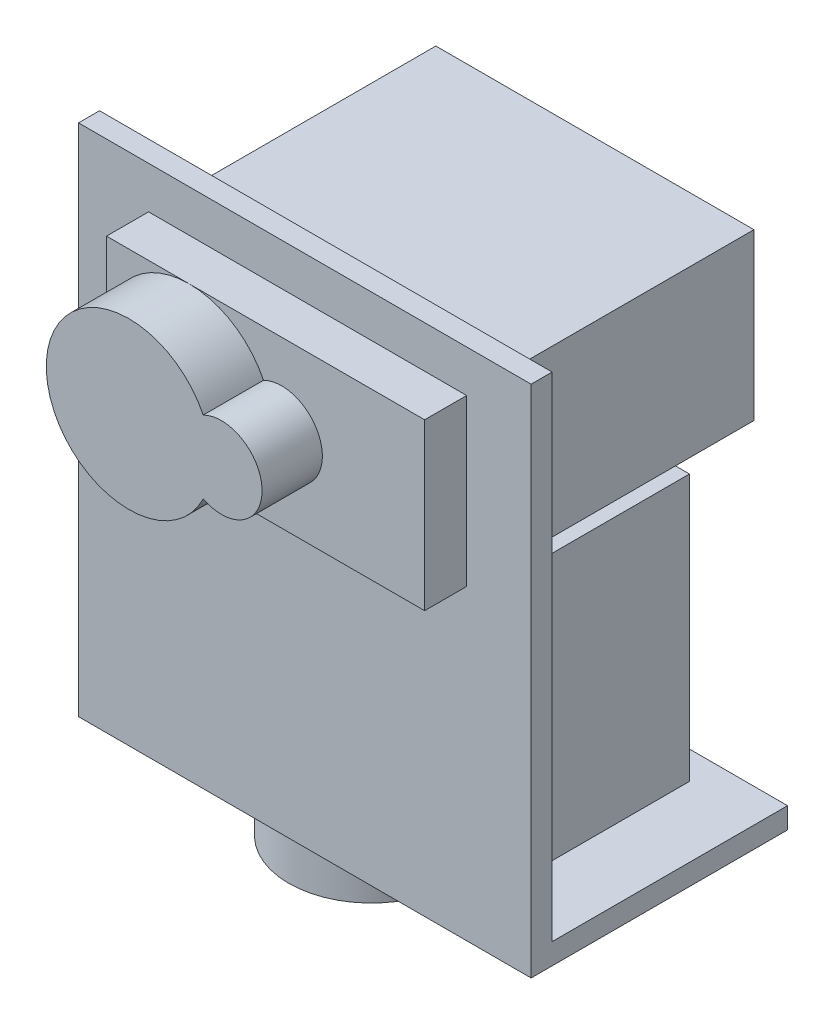
ISO-10303-21;
HEADER;
FILE_DESCRIPTION(('STEP AP214'),'2;1');
FILE_NAME('part.step','',(''),(''),'','','');
FILE_SCHEMA(('AUTOMOTIVE_DESIGN { 1 0 10303 214 1 1 1 1 }'));
ENDSEC;
DATA;
#1=APPLICATION_CONTEXT('core data for automotive mechanical design processes');
#2=APPLICATION_PROTOCOL_DEFINITION('international standard','automotive_design',2000,#1);
#3=PRODUCT_CONTEXT('',#1,'mechanical');
#4=PRODUCT('Part','Part','',(#3));
#5=PRODUCT_RELATED_PRODUCT_CATEGORY('part','',(#4));
#6=PRODUCT_DEFINITION_FORMATION('','',#4);
#7=PRODUCT_DEFINITION_CONTEXT('part definition',#1,'design');
#8=PRODUCT_DEFINITION('design','',#6,#7);
#9=PRODUCT_DEFINITION_SHAPE('','',#8);
#10=(LENGTH_UNIT() NAMED_UNIT(*) SI_UNIT(.MILLI.,.METRE.));
#11=(NAMED_UNIT(*) PLANE_ANGLE_UNIT() SI_UNIT($,.RADIAN.));
#12=(NAMED_UNIT(*) SI_UNIT($,.STERADIAN.) SOLID_ANGLE_UNIT());
#13=UNCERTAINTY_MEASURE_WITH_UNIT(LENGTH_MEASURE(1.E-05),#10,'distance_accuracy_value','');
#14=(GEOMETRIC_REPRESENTATION_CONTEXT(3) GLOBAL_UNCERTAINTY_ASSIGNED_CONTEXT((#13)) GLOBAL_UNIT_ASSIGNED_CONTEXT((#10,
#11,#12)) REPRESENTATION_CONTEXT('',''));
#15=CARTESIAN_POINT('',(0.,0.,0.));
#16=DIRECTION('',(0.,0.,1.));
#17=DIRECTION('',(1.,0.,0.));
#18=AXIS2_PLACEMENT_3D('',#15,#16,#17);
#19=CARTESIAN_POINT('',(0.,0.,4.5));
#20=DIRECTION('',(0.,0.,-1.));
#21=DIRECTION('',(-1.,0.,0.));
#22=AXIS2_PLACEMENT_3D('',#19,#20,#21);
#23=PLANE('',#22);
#24=CARTESIAN_POINT('',(-5.25,9.44999999999999,4.5));
#25=DIRECTION('',(0.,0.,1.));
#26=DIRECTION('',(0.,-1.,0.));
#27=AXIS2_PLACEMENT_3D('',#24,#25,#26);
#28=CIRCLE('',#27,5.9);
#29=CARTESIAN_POINT('',(0.0500000000000066,12.0422962793631,4.5));
#30=VERTEX_POINT('',#29);
#31=CARTESIAN_POINT('',(-5.25,15.35,4.5));
#32=VERTEX_POINT('',#31);
#33=EDGE_CURVE('E63',#30,#32,#28,.T.);
#34=ORIENTED_EDGE('',*,*,#33,.F.);
#35=CARTESIAN_POINT('',(1.35,9.44999999999999,4.5));
#36=DIRECTION('',(0.,0.,1.));
#37=DIRECTION('',(0.,-1.,0.));
#38=AXIS2_PLACEMENT_3D('',#35,#36,#37);
#39=CIRCLE('',#38,2.9);
#40=CARTESIAN_POINT('',(0.0500000000000066,6.85770372063684,4.5));
#41=VERTEX_POINT('',#40);
#42=EDGE_CURVE('E345',#41,#30,#39,.T.);
#43=ORIENTED_EDGE('',*,*,#42,.F.);
#44=CARTESIAN_POINT('',(-5.25,3.54999999999999,4.5));
#45=VERTEX_POINT('',#44);
#46=EDGE_CURVE('E351',#45,#41,#28,.T.);
#47=ORIENTED_EDGE('',*,*,#46,.F.);
#48=DIRECTION('',(1.,0.,0.));
#49=VECTOR('',#48,1.);
#50=CARTESIAN_POINT('',(11.55,3.54999999999999,4.5));
#51=LINE('',#50,#49);
#52=CARTESIAN_POINT('',(11.55,3.54999999999999,4.5));
#53=VERTEX_POINT('',#52);
#54=EDGE_CURVE('E378',#45,#53,#51,.T.);
#55=ORIENTED_EDGE('',*,*,#54,.T.);
#56=DIRECTION('',(0.,1.,0.));
#57=VECTOR('',#56,1.);
#58=CARTESIAN_POINT('',(11.55,15.35,4.5));
#59=LINE('',#58,#57);
#60=CARTESIAN_POINT('',(11.55,15.35,4.5));
#61=VERTEX_POINT('',#60);
#62=EDGE_CURVE('E363',#53,#61,#59,.T.);
#63=ORIENTED_EDGE('',*,*,#62,.T.);
#64=DIRECTION('',(-1.,0.,0.));
#65=VECTOR('',#64,1.);
#66=CARTESIAN_POINT('',(11.55,15.35,4.5));
#67=LINE('',#66,#65);
#68=EDGE_CURVE('E369',#61,#32,#67,.T.);
#69=ORIENTED_EDGE('',*,*,#68,.T.);
#70=EDGE_LOOP('',(#34,#43,#47,#55,#63,#69));
#71=FACE_BOUND('',#70,.T.);
#72=ADVANCED_FACE('F51',(#71),#23,.F.);
#73=CARTESIAN_POINT('',(-11.15,9.44999999999999,4.5));
#74=VERTEX_POINT('',#73);
#75=EDGE_CURVE('E11',#32,#74,#28,.T.);
#76=ORIENTED_EDGE('',*,*,#75,.F.);
#77=CARTESIAN_POINT('',(-11.15,15.35,4.5));
#78=VERTEX_POINT('',#77);
#79=EDGE_CURVE('E367',#32,#78,#67,.T.);
#80=ORIENTED_EDGE('',*,*,#79,.T.);
#81=DIRECTION('',(0.,-1.,0.));
#82=VECTOR('',#81,1.);
#83=CARTESIAN_POINT('',(-11.15,15.35,4.5));
#84=LINE('',#83,#82);
#85=EDGE_CURVE('E374',#78,#74,#84,.T.);
#86=ORIENTED_EDGE('',*,*,#85,.T.);
#87=EDGE_LOOP('',(#76,#80,#86));
#88=FACE_BOUND('',#87,.T.);
#89=ADVANCED_FACE('F578',(#88),#23,.F.);
#90=CARTESIAN_POINT('',(0.,0.,1.5));
#91=DIRECTION('',(0.,0.,-1.));
#92=DIRECTION('',(-1.,0.,0.));
#93=AXIS2_PLACEMENT_3D('',#90,#91,#92);
#94=PLANE('',#93);
#95=DIRECTION('',(0.,1.,0.));
#96=VECTOR('',#95,1.);
#97=CARTESIAN_POINT('',(16.15,-18.35,1.5));
#98=LINE('',#97,#96);
#99=CARTESIAN_POINT('',(16.15,-18.35,1.5));
#100=VERTEX_POINT('',#99);
#101=CARTESIAN_POINT('',(16.15,18.35,1.5));
#102=VERTEX_POINT('',#101);
#103=EDGE_CURVE('E514',#100,#102,#98,.T.);
#104=ORIENTED_EDGE('',*,*,#103,.T.);
#105=DIRECTION('',(-1.,0.,0.));
#106=VECTOR('',#105,1.);
#107=CARTESIAN_POINT('',(-16.15,18.35,1.5));
#108=LINE('',#107,#106);
#109=CARTESIAN_POINT('',(-16.15,18.35,1.5));
#110=VERTEX_POINT('',#109);
#111=EDGE_CURVE('E518',#102,#110,#108,.T.);
#112=ORIENTED_EDGE('',*,*,#111,.T.);
#113=DIRECTION('',(0.,-1.,0.));
#114=VECTOR('',#113,1.);
#115=CARTESIAN_POINT('',(-16.15,-18.35,1.5));
#116=LINE('',#115,#114);
#117=CARTESIAN_POINT('',(-16.15,-18.35,1.5));
#118=VERTEX_POINT('',#117);
#119=EDGE_CURVE('E522',#110,#118,#116,.T.);
#120=ORIENTED_EDGE('',*,*,#119,.T.);
#121=DIRECTION('',(1.,0.,0.));
#122=VECTOR('',#121,1.);
#123=CARTESIAN_POINT('',(-16.15,-18.35,1.5));
#124=LINE('',#123,#122);
#125=EDGE_CURVE('E525',#118,#100,#124,.T.);
#126=ORIENTED_EDGE('',*,*,#125,.T.);
#127=EDGE_LOOP('',(#104,#112,#120,#126));
#128=FACE_BOUND('',#127,.T.);
#129=DIRECTION('',(0.,1.,0.));
#130=VECTOR('',#129,1.);
#131=CARTESIAN_POINT('',(11.55,15.35,1.5));
#132=LINE('',#131,#130);
#133=CARTESIAN_POINT('',(11.55,3.54999999999999,1.5));
#134=VERTEX_POINT('',#133);
#135=CARTESIAN_POINT('',(11.55,15.35,1.5));
#136=VERTEX_POINT('',#135);
#137=EDGE_CURVE('E362',#134,#136,#132,.T.);
#138=ORIENTED_EDGE('',*,*,#137,.F.);
#139=DIRECTION('',(1.,0.,0.));
#140=VECTOR('',#139,1.);
#141=CARTESIAN_POINT('',(11.55,3.54999999999999,1.5));
#142=LINE('',#141,#140);
#143=CARTESIAN_POINT('',(-11.15,3.54999999999999,1.5));
#144=VERTEX_POINT('',#143);
#145=EDGE_CURVE('E368',#144,#134,#142,.T.);
#146=ORIENTED_EDGE('',*,*,#145,.F.);
#147=DIRECTION('',(0.,-1.,0.));
#148=VECTOR('',#147,1.);
#149=CARTESIAN_POINT('',(-11.15,15.35,1.5));
#150=LINE('',#149,#148);
#151=CARTESIAN_POINT('',(-11.15,15.35,1.5));
#152=VERTEX_POINT('',#151);
#153=EDGE_CURVE('E391',#152,#144,#150,.T.);
#154=ORIENTED_EDGE('',*,*,#153,.F.);
#155=DIRECTION('',(-1.,0.,0.));
#156=VECTOR('',#155,1.);
#157=CARTESIAN_POINT('',(11.55,15.35,1.5));
#158=LINE('',#157,#156);
#159=EDGE_CURVE('E387',#136,#152,#158,.T.);
#160=ORIENTED_EDGE('',*,*,#159,.F.);
#161=EDGE_LOOP('',(#138,#146,#154,#160));
#162=FACE_BOUND('',#161,.T.);
#163=ADVANCED_FACE('F642',(#128,#162),#94,.F.);
#164=CARTESIAN_POINT('',(0.,-21.35,0.));
#165=DIRECTION('',(0.,1.,0.));
#166=DIRECTION('',(0.,0.,1.));
#167=AXIS2_PLACEMENT_3D('',#164,#165,#166);
#168=PLANE('',#167);
#169=CARTESIAN_POINT('',(-5.65,-21.35,-8.9));
#170=DIRECTION('',(0.,-1.,0.));
#171=DIRECTION('',(0.,0.,-1.));
#172=AXIS2_PLACEMENT_3D('',#169,#170,#171);
#173=CIRCLE('',#172,5.9);
#174=CARTESIAN_POINT('',(-0.35,-21.35,-6.30770372063686));
#175=VERTEX_POINT('',#174);
#176=CARTESIAN_POINT('',(-5.65,-21.35,-3.));
#177=VERTEX_POINT('',#176);
#178=EDGE_CURVE('E419',#175,#177,#173,.T.);
#179=ORIENTED_EDGE('',*,*,#178,.F.);
#180=CARTESIAN_POINT('',(0.949999999999996,-21.35,-8.9));
#181=DIRECTION('',(0.,-1.,0.));
#182=DIRECTION('',(0.,0.,-1.));
#183=AXIS2_PLACEMENT_3D('',#180,#181,#182);
#184=CIRCLE('',#183,2.9);
#185=CARTESIAN_POINT('',(-0.35,-21.35,-11.4922962793631));
#186=VERTEX_POINT('',#185);
#187=EDGE_CURVE('E413',#175,#186,#184,.F.);
#188=ORIENTED_EDGE('',*,*,#187,.T.);
#189=CARTESIAN_POINT('',(-5.65,-21.35,-14.8));
#190=VERTEX_POINT('',#189);
#191=EDGE_CURVE('E429',#190,#186,#173,.T.);
#192=ORIENTED_EDGE('',*,*,#191,.F.);
#193=DIRECTION('',(1.,0.,0.));
#194=VECTOR('',#193,1.);
#195=CARTESIAN_POINT('',(-11.55,-21.35,-14.8));
#196=LINE('',#195,#194);
#197=CARTESIAN_POINT('',(11.15,-21.35,-14.8));
#198=VERTEX_POINT('',#197);
#199=EDGE_CURVE('E442',#190,#198,#196,.T.);
#200=ORIENTED_EDGE('',*,*,#199,.T.);
#201=DIRECTION('',(0.,0.,1.));
#202=VECTOR('',#201,1.);
#203=CARTESIAN_POINT('',(11.15,-21.35,-14.8));
#204=LINE('',#203,#202);
#205=CARTESIAN_POINT('',(11.15,-21.35,-3.));
#206=VERTEX_POINT('',#205);
#207=EDGE_CURVE('E448',#198,#206,#204,.T.);
#208=ORIENTED_EDGE('',*,*,#207,.T.);
#209=DIRECTION('',(-1.,0.,0.));
#210=VECTOR('',#209,1.);
#211=CARTESIAN_POINT('',(-11.55,-21.35,-3.));
#212=LINE('',#211,#210);
#213=EDGE_CURVE('E452',#206,#177,#212,.T.);
#214=ORIENTED_EDGE('',*,*,#213,.T.);
#215=EDGE_LOOP('',(#179,#188,#192,#200,#208,#214));
#216=FACE_BOUND('',#215,.T.);
#217=ADVANCED_FACE('F616',(#216),#168,.F.);
#218=CARTESIAN_POINT('',(-11.55,-21.35,-8.9));
#219=VERTEX_POINT('',#218);
#220=EDGE_CURVE('E428',#177,#219,#173,.T.);
#221=ORIENTED_EDGE('',*,*,#220,.F.);
#222=CARTESIAN_POINT('',(-11.55,-21.35,-3.));
#223=VERTEX_POINT('',#222);
#224=EDGE_CURVE('E451',#177,#223,#212,.T.);
#225=ORIENTED_EDGE('',*,*,#224,.T.);
#226=DIRECTION('',(0.,0.,-1.));
#227=VECTOR('',#226,1.);
#228=CARTESIAN_POINT('',(-11.55,-21.35,-14.8));
#229=LINE('',#228,#227);
#230=EDGE_CURVE('E438',#223,#219,#229,.T.);
#231=ORIENTED_EDGE('',*,*,#230,.T.);
#232=EDGE_LOOP('',(#221,#225,#231));
#233=FACE_BOUND('',#232,.T.);
#234=ADVANCED_FACE('F598',(#233),#168,.F.);
#235=CARTESIAN_POINT('',(-16.15,-18.35,1.5));
#236=DIRECTION('',(0.,1.,0.));
#237=DIRECTION('',(0.,0.,1.));
#238=AXIS2_PLACEMENT_3D('',#235,#236,#237);
#239=PLANE('',#238);
#240=DIRECTION('',(0.,0.,-1.));
#241=VECTOR('',#240,1.);
#242=CARTESIAN_POINT('',(-16.15,-18.35,1.5));
#243=LINE('',#242,#241);
#244=CARTESIAN_POINT('',(-16.15,-18.35,-16.8));
#245=VERTEX_POINT('',#244);
#246=EDGE_CURVE('E539',#118,#245,#243,.T.);
#247=ORIENTED_EDGE('',*,*,#246,.T.);
#248=DIRECTION('',(-1.,0.,0.));
#249=VECTOR('',#248,1.);
#250=CARTESIAN_POINT('',(16.15,-18.35,-16.8));
#251=LINE('',#250,#249);
#252=CARTESIAN_POINT('',(16.15,-18.35,-16.8));
#253=VERTEX_POINT('',#252);
#254=EDGE_CURVE('E492',#253,#245,#251,.T.);
#255=ORIENTED_EDGE('',*,*,#254,.F.);
#256=DIRECTION('',(0.,0.,-1.));
#257=VECTOR('',#256,1.);
#258=CARTESIAN_POINT('',(16.15,-18.35,1.5));
#259=LINE('',#258,#257);
#260=EDGE_CURVE('E528',#100,#253,#259,.T.);
#261=ORIENTED_EDGE('',*,*,#260,.F.);
#262=ORIENTED_EDGE('',*,*,#125,.F.);
#263=EDGE_LOOP('',(#247,#255,#261,#262));
#264=FACE_BOUND('',#263,.T.);
#265=DIRECTION('',(0.,0.,-1.));
#266=VECTOR('',#265,1.);
#267=CARTESIAN_POINT('',(-11.55,-18.35,-14.8));
#268=LINE('',#267,#266);
#269=CARTESIAN_POINT('',(-11.55,-18.35,-3.));
#270=VERTEX_POINT('',#269);
#271=CARTESIAN_POINT('',(-11.55,-18.35,-14.8));
#272=VERTEX_POINT('',#271);
#273=EDGE_CURVE('E437',#270,#272,#268,.T.);
#274=ORIENTED_EDGE('',*,*,#273,.F.);
#275=DIRECTION('',(-1.,0.,0.));
#276=VECTOR('',#275,1.);
#277=CARTESIAN_POINT('',(-11.55,-18.35,-3.));
#278=LINE('',#277,#276);
#279=CARTESIAN_POINT('',(11.15,-18.35,-3.));
#280=VERTEX_POINT('',#279);
#281=EDGE_CURVE('E468',#280,#270,#278,.T.);
#282=ORIENTED_EDGE('',*,*,#281,.F.);
#283=DIRECTION('',(0.,0.,1.));
#284=VECTOR('',#283,1.);
#285=CARTESIAN_POINT('',(11.15,-18.35,-14.8));
#286=LINE('',#285,#284);
#287=CARTESIAN_POINT('',(11.15,-18.35,-14.8));
#288=VERTEX_POINT('',#287);
#289=EDGE_CURVE('E464',#288,#280,#286,.T.);
#290=ORIENTED_EDGE('',*,*,#289,.F.);
#291=DIRECTION('',(1.,0.,0.));
#292=VECTOR('',#291,1.);
#293=CARTESIAN_POINT('',(-11.55,-18.35,-14.8));
#294=LINE('',#293,#292);
#295=EDGE_CURVE('E460',#272,#288,#294,.T.);
#296=ORIENTED_EDGE('',*,*,#295,.F.);
#297=EDGE_LOOP('',(#274,#282,#290,#296));
#298=FACE_BOUND('',#297,.T.);
#299=ADVANCED_FACE('F836',(#264,#298),#239,.F.);
#300=CARTESIAN_POINT('',(16.15,-18.35,1.5));
#301=DIRECTION('',(-1.,0.,0.));
#302=DIRECTION('',(0.,0.,1.));
#303=AXIS2_PLACEMENT_3D('',#300,#301,#302);
#304=PLANE('',#303);
#305=ORIENTED_EDGE('',*,*,#260,.T.);
#306=DIRECTION('',(0.,-1.,0.));
#307=VECTOR('',#306,1.);
#308=CARTESIAN_POINT('',(16.15,-18.35,-16.8));
#309=LINE('',#308,#307);
#310=CARTESIAN_POINT('',(16.15,-16.85,-16.8));
#311=VERTEX_POINT('',#310);
#312=EDGE_CURVE('E488',#311,#253,#309,.T.);
#313=ORIENTED_EDGE('',*,*,#312,.F.);
#314=DIRECTION('',(0.,0.,1.));
#315=VECTOR('',#314,1.);
#316=CARTESIAN_POINT('',(16.15,-16.85,-16.8));
#317=LINE('',#316,#315);
#318=CARTESIAN_POINT('',(16.15,-16.85,0.));
#319=VERTEX_POINT('',#318);
#320=EDGE_CURVE('E502',#311,#319,#317,.T.);
#321=ORIENTED_EDGE('',*,*,#320,.T.);
#322=DIRECTION('',(0.,1.,0.));
#323=VECTOR('',#322,1.);
#324=CARTESIAN_POINT('',(16.15,-18.35,0.));
#325=LINE('',#324,#323);
#326=CARTESIAN_POINT('',(16.15,18.35,0.));
#327=VERTEX_POINT('',#326);
#328=EDGE_CURVE('E513',#319,#327,#325,.T.);
#329=ORIENTED_EDGE('',*,*,#328,.T.);
#330=DIRECTION('',(0.,0.,-1.));
#331=VECTOR('',#330,1.);
#332=CARTESIAN_POINT('',(16.15,18.35,1.5));
#333=LINE('',#332,#331);
#334=EDGE_CURVE('E55',#102,#327,#333,.T.);
#335=ORIENTED_EDGE('',*,*,#334,.F.);
#336=ORIENTED_EDGE('',*,*,#103,.F.);
#337=EDGE_LOOP('',(#305,#313,#321,#329,#335,#336));
#338=FACE_BOUND('',#337,.T.);
#339=ADVANCED_FACE('F53',(#338),#304,.F.);
#340=CARTESIAN_POINT('',(-16.15,18.35,1.5));
#341=DIRECTION('',(0.,-1.,0.));
#342=DIRECTION('',(0.,0.,-1.));
#343=AXIS2_PLACEMENT_3D('',#340,#341,#342);
#344=PLANE('',#343);
#345=DIRECTION('',(-1.,0.,0.));
#346=VECTOR('',#345,1.);
#347=CARTESIAN_POINT('',(-16.15,18.35,0.));
#348=LINE('',#347,#346);
#349=CARTESIAN_POINT('',(-16.15,18.35,0.));
#350=VERTEX_POINT('',#349);
#351=EDGE_CURVE('E531',#327,#350,#348,.T.);
#352=ORIENTED_EDGE('',*,*,#351,.T.);
#353=DIRECTION('',(0.,0.,-1.));
#354=VECTOR('',#353,1.);
#355=CARTESIAN_POINT('',(-16.15,18.35,1.5));
#356=LINE('',#355,#354);
#357=EDGE_CURVE('E541',#110,#350,#356,.T.);
#358=ORIENTED_EDGE('',*,*,#357,.F.);
#359=ORIENTED_EDGE('',*,*,#111,.F.);
#360=ORIENTED_EDGE('',*,*,#334,.T.);
#361=EDGE_LOOP('',(#352,#358,#359,#360));
#362=FACE_BOUND('',#361,.T.);
#363=ADVANCED_FACE('F832',(#362),#344,.F.);
#364=CARTESIAN_POINT('',(-16.15,-18.35,1.5));
#365=DIRECTION('',(1.,0.,0.));
#366=DIRECTION('',(0.,0.,-1.));
#367=AXIS2_PLACEMENT_3D('',#364,#365,#366);
#368=PLANE('',#367);
#369=DIRECTION('',(0.,-1.,0.));
#370=VECTOR('',#369,1.);
#371=CARTESIAN_POINT('',(-16.15,-18.35,0.));
#372=LINE('',#371,#370);
#373=CARTESIAN_POINT('',(-16.15,-16.85,0.));
#374=VERTEX_POINT('',#373);
#375=EDGE_CURVE('E519',#350,#374,#372,.T.);
#376=ORIENTED_EDGE('',*,*,#375,.T.);
#377=DIRECTION('',(0.,0.,1.));
#378=VECTOR('',#377,1.);
#379=CARTESIAN_POINT('',(-16.15,-16.85,-16.8));
#380=LINE('',#379,#378);
#381=CARTESIAN_POINT('',(-16.15,-16.85,-16.8));
#382=VERTEX_POINT('',#381);
#383=EDGE_CURVE('E509',#382,#374,#380,.T.);
#384=ORIENTED_EDGE('',*,*,#383,.F.);
#385=DIRECTION('',(0.,1.,0.));
#386=VECTOR('',#385,1.);
#387=CARTESIAN_POINT('',(-16.15,-18.35,-16.8));
#388=LINE('',#387,#386);
#389=EDGE_CURVE('E496',#245,#382,#388,.T.);
#390=ORIENTED_EDGE('',*,*,#389,.F.);
#391=ORIENTED_EDGE('',*,*,#246,.F.);
#392=ORIENTED_EDGE('',*,*,#119,.F.);
#393=ORIENTED_EDGE('',*,*,#357,.T.);
#394=EDGE_LOOP('',(#376,#384,#390,#391,#392,#393));
#395=FACE_BOUND('',#394,.T.);
#396=ADVANCED_FACE('F831',(#395),#368,.F.);
#397=CARTESIAN_POINT('',(0.,0.,0.));
#398=DIRECTION('',(0.,0.,-1.));
#399=DIRECTION('',(-1.,0.,0.));
#400=AXIS2_PLACEMENT_3D('',#397,#398,#399);
#401=PLANE('',#400);
#402=DIRECTION('',(0.,1.,0.));
#403=VECTOR('',#402,1.);
#404=CARTESIAN_POINT('',(11.55,0.,0.));
#405=LINE('',#404,#403);
#406=CARTESIAN_POINT('',(11.55,3.54999999999999,0.));
#407=VERTEX_POINT('',#406);
#408=CARTESIAN_POINT('',(11.55,15.35,0.));
#409=VERTEX_POINT('',#408);
#410=EDGE_CURVE('E296',#407,#409,#405,.T.);
#411=ORIENTED_EDGE('',*,*,#410,.T.);
#412=DIRECTION('',(1.,0.,0.));
#413=VECTOR('',#412,1.);
#414=CARTESIAN_POINT('',(0.,15.35,0.));
#415=LINE('',#414,#413);
#416=CARTESIAN_POINT('',(-11.15,15.35,0.));
#417=VERTEX_POINT('',#416);
#418=EDGE_CURVE('E321',#417,#409,#415,.T.);
#419=ORIENTED_EDGE('',*,*,#418,.F.);
#420=DIRECTION('',(0.,1.,0.));
#421=VECTOR('',#420,1.);
#422=CARTESIAN_POINT('',(-11.15,0.,0.));
#423=LINE('',#422,#421);
#424=CARTESIAN_POINT('',(-11.15,3.54999999999999,0.));
#425=VERTEX_POINT('',#424);
#426=EDGE_CURVE('E324',#425,#417,#423,.T.);
#427=ORIENTED_EDGE('',*,*,#426,.F.);
#428=DIRECTION('',(1.,0.,0.));
#429=VECTOR('',#428,1.);
#430=CARTESIAN_POINT('',(0.,3.54999999999999,0.));
#431=LINE('',#430,#429);
#432=EDGE_CURVE('E307',#425,#407,#431,.T.);
#433=ORIENTED_EDGE('',*,*,#432,.T.);
#434=EDGE_LOOP('',(#411,#419,#427,#433));
#435=FACE_BOUND('',#434,.T.);
#436=DIRECTION('',(1.,0.,0.));
#437=VECTOR('',#436,1.);
#438=CARTESIAN_POINT('',(16.15,-16.85,0.));
#439=LINE('',#438,#437);
#440=EDGE_CURVE('E487',#374,#319,#439,.T.);
#441=ORIENTED_EDGE('',*,*,#440,.F.);
#442=ORIENTED_EDGE('',*,*,#375,.F.);
#443=ORIENTED_EDGE('',*,*,#351,.F.);
#444=ORIENTED_EDGE('',*,*,#328,.F.);
#445=EDGE_LOOP('',(#441,#442,#443,#444));
#446=FACE_BOUND('',#445,.T.);
#447=ADVANCED_FACE('F816',(#435,#446),#401,.T.);
#448=CARTESIAN_POINT('',(16.15,-16.85,-16.8));
#449=DIRECTION('',(0.,-1.,0.));
#450=DIRECTION('',(0.,0.,-1.));
#451=AXIS2_PLACEMENT_3D('',#448,#449,#450);
#452=PLANE('',#451);
#453=DIRECTION('',(0.,0.,1.));
#454=VECTOR('',#453,1.);
#455=CARTESIAN_POINT('',(11.15,-16.85,-16.8));
#456=LINE('',#455,#454);
#457=CARTESIAN_POINT('',(11.15,-16.85,-14.8));
#458=VERTEX_POINT('',#457);
#459=CARTESIAN_POINT('',(11.15,-16.85,-3.));
#460=VERTEX_POINT('',#459);
#461=EDGE_CURVE('E277',#458,#460,#456,.T.);
#462=ORIENTED_EDGE('',*,*,#461,.T.);
#463=DIRECTION('',(-1.,0.,0.));
#464=VECTOR('',#463,1.);
#465=CARTESIAN_POINT('',(16.15,-16.85,-3.));
#466=LINE('',#465,#464);
#467=CARTESIAN_POINT('',(-11.55,-16.85,-3.));
#468=VERTEX_POINT('',#467);
#469=EDGE_CURVE('E287',#460,#468,#466,.T.);
#470=ORIENTED_EDGE('',*,*,#469,.T.);
#471=DIRECTION('',(0.,0.,-1.));
#472=VECTOR('',#471,1.);
#473=CARTESIAN_POINT('',(-11.55,-16.85,-16.8));
#474=LINE('',#473,#472);
#475=CARTESIAN_POINT('',(-11.55,-16.85,-14.8));
#476=VERTEX_POINT('',#475);
#477=EDGE_CURVE('E254',#468,#476,#474,.T.);
#478=ORIENTED_EDGE('',*,*,#477,.T.);
#479=DIRECTION('',(1.,0.,0.));
#480=VECTOR('',#479,1.);
#481=CARTESIAN_POINT('',(16.15,-16.85,-14.8));
#482=LINE('',#481,#480);
#483=EDGE_CURVE('E70',#476,#458,#482,.T.);
#484=ORIENTED_EDGE('',*,*,#483,.T.);
#485=EDGE_LOOP('',(#462,#470,#478,#484));
#486=FACE_BOUND('',#485,.T.);
#487=ORIENTED_EDGE('',*,*,#440,.T.);
#488=ORIENTED_EDGE('',*,*,#320,.F.);
#489=DIRECTION('',(1.,0.,0.));
#490=VECTOR('',#489,1.);
#491=CARTESIAN_POINT('',(16.15,-16.85,-16.8));
#492=LINE('',#491,#490);
#493=EDGE_CURVE('E499',#382,#311,#492,.T.);
#494=ORIENTED_EDGE('',*,*,#493,.F.);
#495=ORIENTED_EDGE('',*,*,#383,.T.);
#496=EDGE_LOOP('',(#487,#488,#494,#495));
#497=FACE_BOUND('',#496,.T.);
#498=ADVANCED_FACE('F813',(#486,#497),#452,.F.);
#499=CARTESIAN_POINT('',(0.,0.,-16.8));
#500=DIRECTION('',(0.,0.,1.));
#501=DIRECTION('',(1.,0.,0.));
#502=AXIS2_PLACEMENT_3D('',#499,#500,#501);
#503=PLANE('',#502);
#504=ORIENTED_EDGE('',*,*,#312,.T.);
#505=ORIENTED_EDGE('',*,*,#254,.T.);
#506=ORIENTED_EDGE('',*,*,#389,.T.);
#507=ORIENTED_EDGE('',*,*,#493,.T.);
#508=EDGE_LOOP('',(#504,#505,#506,#507));
#509=FACE_BOUND('',#508,.T.);
#510=ADVANCED_FACE('F815',(#509),#503,.F.);
#511=CARTESIAN_POINT('',(-11.55,-21.35,-14.8));
#512=DIRECTION('',(1.,0.,0.));
#513=DIRECTION('',(0.,0.,-1.));
#514=AXIS2_PLACEMENT_3D('',#511,#512,#513);
#515=PLANE('',#514);
#516=ORIENTED_EDGE('',*,*,#273,.T.);
#517=DIRECTION('',(0.,1.,0.));
#518=VECTOR('',#517,1.);
#519=CARTESIAN_POINT('',(-11.55,-21.35,-14.8));
#520=LINE('',#519,#518);
#521=CARTESIAN_POINT('',(-11.55,-21.35,-14.8));
#522=VERTEX_POINT('',#521);
#523=EDGE_CURVE('E483',#522,#272,#520,.T.);
#524=ORIENTED_EDGE('',*,*,#523,.F.);
#525=EDGE_CURVE('E443',#219,#522,#229,.T.);
#526=ORIENTED_EDGE('',*,*,#525,.F.);
#527=ORIENTED_EDGE('',*,*,#230,.F.);
#528=DIRECTION('',(0.,1.,0.));
#529=VECTOR('',#528,1.);
#530=CARTESIAN_POINT('',(-11.55,-21.35,-3.));
#531=LINE('',#530,#529);
#532=EDGE_CURVE('E456',#223,#270,#531,.T.);
#533=ORIENTED_EDGE('',*,*,#532,.T.);
#534=EDGE_LOOP('',(#516,#524,#526,#527,#533));
#535=FACE_BOUND('',#534,.T.);
#536=ADVANCED_FACE('F605',(#535),#515,.F.);
#537=CARTESIAN_POINT('',(-11.55,-21.35,-14.8));
#538=DIRECTION('',(0.,0.,1.));
#539=DIRECTION('',(1.,0.,0.));
#540=AXIS2_PLACEMENT_3D('',#537,#538,#539);
#541=PLANE('',#540);
#542=ORIENTED_EDGE('',*,*,#295,.T.);
#543=DIRECTION('',(0.,1.,0.));
#544=VECTOR('',#543,1.);
#545=CARTESIAN_POINT('',(11.15,-21.35,-14.8));
#546=LINE('',#545,#544);
#547=EDGE_CURVE('E479',#198,#288,#546,.T.);
#548=ORIENTED_EDGE('',*,*,#547,.F.);
#549=ORIENTED_EDGE('',*,*,#199,.F.);
#550=EDGE_CURVE('E444',#522,#190,#196,.T.);
#551=ORIENTED_EDGE('',*,*,#550,.F.);
#552=ORIENTED_EDGE('',*,*,#523,.T.);
#553=EDGE_LOOP('',(#542,#548,#549,#551,#552));
#554=FACE_BOUND('',#553,.T.);
#555=ADVANCED_FACE('F612',(#554),#541,.F.);
#556=CARTESIAN_POINT('',(11.15,-21.35,-14.8));
#557=DIRECTION('',(-1.,0.,0.));
#558=DIRECTION('',(0.,0.,1.));
#559=AXIS2_PLACEMENT_3D('',#556,#557,#558);
#560=PLANE('',#559);
#561=ORIENTED_EDGE('',*,*,#289,.T.);
#562=DIRECTION('',(0.,1.,0.));
#563=VECTOR('',#562,1.);
#564=CARTESIAN_POINT('',(11.15,-21.35,-3.));
#565=LINE('',#564,#563);
#566=EDGE_CURVE('E475',#206,#280,#565,.T.);
#567=ORIENTED_EDGE('',*,*,#566,.F.);
#568=ORIENTED_EDGE('',*,*,#207,.F.);
#569=ORIENTED_EDGE('',*,*,#547,.T.);
#570=EDGE_LOOP('',(#561,#567,#568,#569));
#571=FACE_BOUND('',#570,.T.);
#572=ADVANCED_FACE('F841',(#571),#560,.F.);
#573=CARTESIAN_POINT('',(-11.55,-21.35,-3.));
#574=DIRECTION('',(0.,0.,-1.));
#575=DIRECTION('',(-1.,0.,0.));
#576=AXIS2_PLACEMENT_3D('',#573,#574,#575);
#577=PLANE('',#576);
#578=ORIENTED_EDGE('',*,*,#281,.T.);
#579=ORIENTED_EDGE('',*,*,#532,.F.);
#580=ORIENTED_EDGE('',*,*,#224,.F.);
#581=ORIENTED_EDGE('',*,*,#213,.F.);
#582=ORIENTED_EDGE('',*,*,#566,.T.);
#583=EDGE_LOOP('',(#578,#579,#580,#581,#582));
#584=FACE_BOUND('',#583,.T.);
#585=ADVANCED_FACE('F602',(#584),#577,.F.);
#586=EDGE_CURVE('E554',#219,#190,#173,.T.);
#587=ORIENTED_EDGE('',*,*,#586,.F.);
#588=ORIENTED_EDGE('',*,*,#525,.T.);
#589=ORIENTED_EDGE('',*,*,#550,.T.);
#590=EDGE_LOOP('',(#587,#588,#589));
#591=FACE_BOUND('',#590,.T.);
#592=ADVANCED_FACE('F609',(#591),#168,.F.);
#593=CARTESIAN_POINT('',(0.949999999999996,-25.65,-8.9));
#594=DIRECTION('',(0.,1.,0.));
#595=DIRECTION('',(0.,0.,1.));
#596=AXIS2_PLACEMENT_3D('',#593,#594,#595);
#597=CYLINDRICAL_SURFACE('',#596,2.9);
#598=ORIENTED_EDGE('',*,*,#187,.F.);
#599=DIRECTION('',(0.,1.,0.));
#600=VECTOR('',#599,1.);
#601=CARTESIAN_POINT('',(-0.35,-25.65,-6.30770372063686));
#602=LINE('',#601,#600);
#603=CARTESIAN_POINT('',(-0.35,-25.65,-6.30770372063686));
#604=VERTEX_POINT('',#603);
#605=EDGE_CURVE('E433',#604,#175,#602,.T.);
#606=ORIENTED_EDGE('',*,*,#605,.F.);
#607=CARTESIAN_POINT('',(0.949999999999996,-25.65,-8.9));
#608=DIRECTION('',(0.,-1.,0.));
#609=DIRECTION('',(0.,0.,-1.));
#610=AXIS2_PLACEMENT_3D('',#607,#608,#609);
#611=CIRCLE('',#610,2.9);
#612=CARTESIAN_POINT('',(-0.35,-25.65,-11.4922962793631));
#613=VERTEX_POINT('',#612);
#614=EDGE_CURVE('E414',#604,#613,#611,.F.);
#615=ORIENTED_EDGE('',*,*,#614,.T.);
#616=DIRECTION('',(0.,1.,0.));
#617=VECTOR('',#616,1.);
#618=CARTESIAN_POINT('',(-0.35,-25.65,-11.4922962793631));
#619=LINE('',#618,#617);
#620=EDGE_CURVE('E422',#613,#186,#619,.T.);
#621=ORIENTED_EDGE('',*,*,#620,.T.);
#622=EDGE_LOOP('',(#598,#606,#615,#621));
#623=FACE_BOUND('',#622,.T.);
#624=ADVANCED_FACE('F620',(#623),#597,.T.);
#625=CARTESIAN_POINT('',(-5.65,-25.65,-8.9));
#626=DIRECTION('',(0.,1.,0.));
#627=DIRECTION('',(0.,0.,1.));
#628=AXIS2_PLACEMENT_3D('',#625,#626,#627);
#629=CYLINDRICAL_SURFACE('',#628,5.9);
#630=ORIENTED_EDGE('',*,*,#178,.T.);
#631=ORIENTED_EDGE('',*,*,#220,.T.);
#632=ORIENTED_EDGE('',*,*,#586,.T.);
#633=ORIENTED_EDGE('',*,*,#191,.T.);
#634=ORIENTED_EDGE('',*,*,#620,.F.);
#635=CARTESIAN_POINT('',(-5.65,-25.65,-8.9));
#636=DIRECTION('',(0.,-1.,0.));
#637=DIRECTION('',(0.,0.,-1.));
#638=AXIS2_PLACEMENT_3D('',#635,#636,#637);
#639=CIRCLE('',#638,5.9);
#640=EDGE_CURVE('E418',#604,#613,#639,.T.);
#641=ORIENTED_EDGE('',*,*,#640,.F.);
#642=ORIENTED_EDGE('',*,*,#605,.T.);
#643=EDGE_LOOP('',(#630,#631,#632,#633,#634,#641,#642));
#644=FACE_BOUND('',#643,.T.);
#645=ADVANCED_FACE('F623',(#644),#629,.T.);
#646=CARTESIAN_POINT('',(0.,-25.65,0.));
#647=DIRECTION('',(0.,-1.,0.));
#648=DIRECTION('',(0.,0.,-1.));
#649=AXIS2_PLACEMENT_3D('',#646,#647,#648);
#650=PLANE('',#649);
#651=ORIENTED_EDGE('',*,*,#614,.F.);
#652=ORIENTED_EDGE('',*,*,#640,.T.);
#653=EDGE_LOOP('',(#651,#652));
#654=FACE_BOUND('',#653,.T.);
#655=ADVANCED_FACE('F625',(#654),#650,.T.);
#656=CARTESIAN_POINT('',(11.55,15.35,4.5));
#657=DIRECTION('',(-1.,0.,0.));
#658=DIRECTION('',(0.,0.,1.));
#659=AXIS2_PLACEMENT_3D('',#656,#657,#658);
#660=PLANE('',#659);
#661=ORIENTED_EDGE('',*,*,#137,.T.);
#662=DIRECTION('',(0.,0.,-1.));
#663=VECTOR('',#662,1.);
#664=CARTESIAN_POINT('',(11.55,15.35,4.5));
#665=LINE('',#664,#663);
#666=EDGE_CURVE('E409',#61,#136,#665,.T.);
#667=ORIENTED_EDGE('',*,*,#666,.F.);
#668=ORIENTED_EDGE('',*,*,#62,.F.);
#669=DIRECTION('',(0.,0.,-1.));
#670=VECTOR('',#669,1.);
#671=CARTESIAN_POINT('',(11.55,3.54999999999999,4.5));
#672=LINE('',#671,#670);
#673=EDGE_CURVE('E383',#53,#134,#672,.T.);
#674=ORIENTED_EDGE('',*,*,#673,.T.);
#675=EDGE_LOOP('',(#661,#667,#668,#674));
#676=FACE_BOUND('',#675,.T.);
#677=ADVANCED_FACE('F627',(#676),#660,.F.);
#678=CARTESIAN_POINT('',(11.55,15.35,4.5));
#679=DIRECTION('',(0.,-1.,0.));
#680=DIRECTION('',(0.,0.,-1.));
#681=AXIS2_PLACEMENT_3D('',#678,#679,#680);
#682=PLANE('',#681);
#683=ORIENTED_EDGE('',*,*,#159,.T.);
#684=DIRECTION('',(0.,0.,-1.));
#685=VECTOR('',#684,1.);
#686=CARTESIAN_POINT('',(-11.15,15.35,4.5));
#687=LINE('',#686,#685);
#688=EDGE_CURVE('E405',#78,#152,#687,.T.);
#689=ORIENTED_EDGE('',*,*,#688,.F.);
#690=ORIENTED_EDGE('',*,*,#79,.F.);
#691=ORIENTED_EDGE('',*,*,#68,.F.);
#692=ORIENTED_EDGE('',*,*,#666,.T.);
#693=EDGE_LOOP('',(#683,#689,#690,#691,#692));
#694=FACE_BOUND('',#693,.T.);
#695=ADVANCED_FACE('F583',(#694),#682,.F.);
#696=CARTESIAN_POINT('',(-11.15,15.35,4.5));
#697=DIRECTION('',(1.,0.,0.));
#698=DIRECTION('',(0.,0.,-1.));
#699=AXIS2_PLACEMENT_3D('',#696,#697,#698);
#700=PLANE('',#699);
#701=ORIENTED_EDGE('',*,*,#153,.T.);
#702=DIRECTION('',(0.,0.,-1.));
#703=VECTOR('',#702,1.);
#704=CARTESIAN_POINT('',(-11.15,3.54999999999999,4.5));
#705=LINE('',#704,#703);
#706=CARTESIAN_POINT('',(-11.15,3.54999999999999,4.5));
#707=VERTEX_POINT('',#706);
#708=EDGE_CURVE('E401',#707,#144,#705,.T.);
#709=ORIENTED_EDGE('',*,*,#708,.F.);
#710=EDGE_CURVE('E373',#74,#707,#84,.T.);
#711=ORIENTED_EDGE('',*,*,#710,.F.);
#712=ORIENTED_EDGE('',*,*,#85,.F.);
#713=ORIENTED_EDGE('',*,*,#688,.T.);
#714=EDGE_LOOP('',(#701,#709,#711,#712,#713));
#715=FACE_BOUND('',#714,.T.);
#716=ADVANCED_FACE('F575',(#715),#700,.F.);
#717=CARTESIAN_POINT('',(11.55,3.54999999999999,4.5));
#718=DIRECTION('',(0.,1.,0.));
#719=DIRECTION('',(0.,0.,1.));
#720=AXIS2_PLACEMENT_3D('',#717,#718,#719);
#721=PLANE('',#720);
#722=ORIENTED_EDGE('',*,*,#145,.T.);
#723=ORIENTED_EDGE('',*,*,#673,.F.);
#724=ORIENTED_EDGE('',*,*,#54,.F.);
#725=EDGE_CURVE('E379',#707,#45,#51,.T.);
#726=ORIENTED_EDGE('',*,*,#725,.F.);
#727=ORIENTED_EDGE('',*,*,#708,.T.);
#728=EDGE_LOOP('',(#722,#723,#724,#726,#727));
#729=FACE_BOUND('',#728,.T.);
#730=ADVANCED_FACE('F586',(#729),#721,.F.);
#731=EDGE_CURVE('E61',#74,#45,#28,.T.);
#732=ORIENTED_EDGE('',*,*,#731,.F.);
#733=ORIENTED_EDGE('',*,*,#710,.T.);
#734=ORIENTED_EDGE('',*,*,#725,.T.);
#735=EDGE_LOOP('',(#732,#733,#734));
#736=FACE_BOUND('',#735,.T.);
#737=ADVANCED_FACE('F570',(#736),#23,.F.);
#738=CARTESIAN_POINT('',(-5.25,9.44999999999999,8.8));
#739=DIRECTION('',(0.,0.,-1.));
#740=DIRECTION('',(0.,1.,0.));
#741=AXIS2_PLACEMENT_3D('',#738,#739,#740);
#742=CYLINDRICAL_SURFACE('',#741,5.9);
#743=ORIENTED_EDGE('',*,*,#33,.T.);
#744=ORIENTED_EDGE('',*,*,#75,.T.);
#745=ORIENTED_EDGE('',*,*,#731,.T.);
#746=ORIENTED_EDGE('',*,*,#46,.T.);
#747=DIRECTION('',(0.,0.,-1.));
#748=VECTOR('',#747,1.);
#749=CARTESIAN_POINT('',(0.0500000000000066,6.85770372063684,8.8));
#750=LINE('',#749,#748);
#751=CARTESIAN_POINT('',(0.0500000000000066,6.85770372063684,8.8));
#752=VERTEX_POINT('',#751);
#753=EDGE_CURVE('E358',#752,#41,#750,.T.);
#754=ORIENTED_EDGE('',*,*,#753,.F.);
#755=CARTESIAN_POINT('',(-5.25,9.44999999999999,8.8));
#756=DIRECTION('',(0.,0.,1.));
#757=DIRECTION('',(0.,-1.,0.));
#758=AXIS2_PLACEMENT_3D('',#755,#756,#757);
#759=CIRCLE('',#758,5.9);
#760=CARTESIAN_POINT('',(0.0500000000000066,12.0422962793631,8.8));
#761=VERTEX_POINT('',#760);
#762=EDGE_CURVE('E340',#761,#752,#759,.T.);
#763=ORIENTED_EDGE('',*,*,#762,.F.);
#764=DIRECTION('',(0.,0.,-1.));
#765=VECTOR('',#764,1.);
#766=CARTESIAN_POINT('',(0.0500000000000066,12.0422962793631,8.8));
#767=LINE('',#766,#765);
#768=EDGE_CURVE('E347',#761,#30,#767,.T.);
#769=ORIENTED_EDGE('',*,*,#768,.T.);
#770=EDGE_LOOP('',(#743,#744,#745,#746,#754,#763,#769));
#771=FACE_BOUND('',#770,.T.);
#772=ADVANCED_FACE('F567',(#771),#742,.T.);
#773=CARTESIAN_POINT('',(1.35,9.44999999999999,8.8));
#774=DIRECTION('',(0.,0.,-1.));
#775=DIRECTION('',(0.,1.,0.));
#776=AXIS2_PLACEMENT_3D('',#773,#774,#775);
#777=CYLINDRICAL_SURFACE('',#776,2.9);
#778=ORIENTED_EDGE('',*,*,#42,.T.);
#779=ORIENTED_EDGE('',*,*,#768,.F.);
#780=CARTESIAN_POINT('',(1.35,9.44999999999999,8.8));
#781=DIRECTION('',(0.,0.,1.));
#782=DIRECTION('',(0.,-1.,0.));
#783=AXIS2_PLACEMENT_3D('',#780,#781,#782);
#784=CIRCLE('',#783,2.9);
#785=EDGE_CURVE('E344',#752,#761,#784,.T.);
#786=ORIENTED_EDGE('',*,*,#785,.F.);
#787=ORIENTED_EDGE('',*,*,#753,.T.);
#788=EDGE_LOOP('',(#778,#779,#786,#787));
#789=FACE_BOUND('',#788,.T.);
#790=ADVANCED_FACE('F650',(#789),#777,.T.);
#791=CARTESIAN_POINT('',(0.,0.,8.8));
#792=DIRECTION('',(0.,0.,1.));
#793=DIRECTION('',(0.,-1.,0.));
#794=AXIS2_PLACEMENT_3D('',#791,#792,#793);
#795=PLANE('',#794);
#796=ORIENTED_EDGE('',*,*,#762,.T.);
#797=ORIENTED_EDGE('',*,*,#785,.T.);
#798=EDGE_LOOP('',(#796,#797));
#799=FACE_BOUND('',#798,.T.);
#800=ADVANCED_FACE('F699',(#799),#795,.T.);
#801=CARTESIAN_POINT('',(11.55,0.,-19.));
#802=DIRECTION('',(1.,0.,0.));
#803=DIRECTION('',(0.,0.,-1.));
#804=AXIS2_PLACEMENT_3D('',#801,#802,#803);
#805=PLANE('',#804);
#806=ORIENTED_EDGE('',*,*,#410,.F.);
#807=DIRECTION('',(0.,0.,1.));
#808=VECTOR('',#807,1.);
#809=CARTESIAN_POINT('',(11.55,3.54999999999999,-19.));
#810=LINE('',#809,#808);
#811=CARTESIAN_POINT('',(11.55,3.54999999999999,-19.));
#812=VERTEX_POINT('',#811);
#813=EDGE_CURVE('E330',#812,#407,#810,.T.);
#814=ORIENTED_EDGE('',*,*,#813,.F.);
#815=DIRECTION('',(0.,1.,0.));
#816=VECTOR('',#815,1.);
#817=CARTESIAN_POINT('',(11.55,0.,-19.));
#818=LINE('',#817,#816);
#819=CARTESIAN_POINT('',(11.55,15.35,-19.));
#820=VERTEX_POINT('',#819);
#821=EDGE_CURVE('E302',#812,#820,#818,.T.);
#822=ORIENTED_EDGE('',*,*,#821,.T.);
#823=DIRECTION('',(0.,0.,1.));
#824=VECTOR('',#823,1.);
#825=CARTESIAN_POINT('',(11.55,15.35,-19.));
#826=LINE('',#825,#824);
#827=EDGE_CURVE('E317',#820,#409,#826,.T.);
#828=ORIENTED_EDGE('',*,*,#827,.T.);
#829=EDGE_LOOP('',(#806,#814,#822,#828));
#830=FACE_BOUND('',#829,.T.);
#831=ADVANCED_FACE('F710',(#830),#805,.T.);
#832=CARTESIAN_POINT('',(0.,3.54999999999999,-19.));
#833=DIRECTION('',(0.,-1.,0.));
#834=DIRECTION('',(0.,0.,-1.));
#835=AXIS2_PLACEMENT_3D('',#832,#833,#834);
#836=PLANE('',#835);
#837=ORIENTED_EDGE('',*,*,#432,.F.);
#838=DIRECTION('',(0.,0.,1.));
#839=VECTOR('',#838,1.);
#840=CARTESIAN_POINT('',(-11.15,3.54999999999999,-19.));
#841=LINE('',#840,#839);
#842=CARTESIAN_POINT('',(-11.15,3.54999999999999,-19.));
#843=VERTEX_POINT('',#842);
#844=EDGE_CURVE('E333',#843,#425,#841,.T.);
#845=ORIENTED_EDGE('',*,*,#844,.F.);
#846=DIRECTION('',(1.,0.,0.));
#847=VECTOR('',#846,1.);
#848=CARTESIAN_POINT('',(0.,3.54999999999999,-19.));
#849=LINE('',#848,#847);
#850=EDGE_CURVE('E313',#843,#812,#849,.T.);
#851=ORIENTED_EDGE('',*,*,#850,.T.);
#852=ORIENTED_EDGE('',*,*,#813,.T.);
#853=EDGE_LOOP('',(#837,#845,#851,#852));
#854=FACE_BOUND('',#853,.T.);
#855=ADVANCED_FACE('F724',(#854),#836,.T.);
#856=CARTESIAN_POINT('',(-11.15,0.,-19.));
#857=DIRECTION('',(1.,0.,0.));
#858=DIRECTION('',(0.,0.,-1.));
#859=AXIS2_PLACEMENT_3D('',#856,#857,#858);
#860=PLANE('',#859);
#861=ORIENTED_EDGE('',*,*,#426,.T.);
#862=DIRECTION('',(0.,0.,1.));
#863=VECTOR('',#862,1.);
#864=CARTESIAN_POINT('',(-11.15,15.35,-19.));
#865=LINE('',#864,#863);
#866=CARTESIAN_POINT('',(-11.15,15.35,-19.));
#867=VERTEX_POINT('',#866);
#868=EDGE_CURVE('E78',#867,#417,#865,.T.);
#869=ORIENTED_EDGE('',*,*,#868,.F.);
#870=DIRECTION('',(0.,1.,0.));
#871=VECTOR('',#870,1.);
#872=CARTESIAN_POINT('',(-11.15,0.,-19.));
#873=LINE('',#872,#871);
#874=EDGE_CURVE('E310',#843,#867,#873,.T.);
#875=ORIENTED_EDGE('',*,*,#874,.F.);
#876=ORIENTED_EDGE('',*,*,#844,.T.);
#877=EDGE_LOOP('',(#861,#869,#875,#876));
#878=FACE_BOUND('',#877,.T.);
#879=ADVANCED_FACE('F734',(#878),#860,.F.);
#880=CARTESIAN_POINT('',(0.,15.35,-19.));
#881=DIRECTION('',(0.,-1.,0.));
#882=DIRECTION('',(0.,0.,-1.));
#883=AXIS2_PLACEMENT_3D('',#880,#881,#882);
#884=PLANE('',#883);
#885=ORIENTED_EDGE('',*,*,#418,.T.);
#886=ORIENTED_EDGE('',*,*,#827,.F.);
#887=DIRECTION('',(1.,0.,0.));
#888=VECTOR('',#887,1.);
#889=CARTESIAN_POINT('',(0.,15.35,-19.));
#890=LINE('',#889,#888);
#891=EDGE_CURVE('E306',#867,#820,#890,.T.);
#892=ORIENTED_EDGE('',*,*,#891,.F.);
#893=ORIENTED_EDGE('',*,*,#868,.T.);
#894=EDGE_LOOP('',(#885,#886,#892,#893));
#895=FACE_BOUND('',#894,.T.);
#896=ADVANCED_FACE('F744',(#895),#884,.F.);
#897=CARTESIAN_POINT('',(0.,0.,-19.));
#898=DIRECTION('',(0.,0.,-1.));
#899=DIRECTION('',(-1.,0.,0.));
#900=AXIS2_PLACEMENT_3D('',#897,#898,#899);
#901=PLANE('',#900);
#902=ORIENTED_EDGE('',*,*,#821,.F.);
#903=ORIENTED_EDGE('',*,*,#850,.F.);
#904=ORIENTED_EDGE('',*,*,#874,.T.);
#905=ORIENTED_EDGE('',*,*,#891,.T.);
#906=EDGE_LOOP('',(#902,#903,#904,#905));
#907=FACE_BOUND('',#906,.T.);
#908=ADVANCED_FACE('F754',(#907),#901,.T.);
#909=CARTESIAN_POINT('',(16.15,2.15,-3.));
#910=DIRECTION('',(0.,0.,1.));
#911=DIRECTION('',(1.,0.,0.));
#912=AXIS2_PLACEMENT_3D('',#909,#910,#911);
#913=PLANE('',#912);
#914=ORIENTED_EDGE('',*,*,#469,.F.);
#915=DIRECTION('',(0.,-1.,0.));
#916=VECTOR('',#915,1.);
#917=CARTESIAN_POINT('',(11.15,2.15,-3.));
#918=LINE('',#917,#916);
#919=CARTESIAN_POINT('',(11.15,2.15,-3.));
#920=VERTEX_POINT('',#919);
#921=EDGE_CURVE('E275',#920,#460,#918,.T.);
#922=ORIENTED_EDGE('',*,*,#921,.F.);
#923=DIRECTION('',(-1.,0.,0.));
#924=VECTOR('',#923,1.);
#925=CARTESIAN_POINT('',(16.15,2.15,-3.));
#926=LINE('',#925,#924);
#927=CARTESIAN_POINT('',(-11.55,2.15,-3.));
#928=VERTEX_POINT('',#927);
#929=EDGE_CURVE('E268',#920,#928,#926,.T.);
#930=ORIENTED_EDGE('',*,*,#929,.T.);
#931=DIRECTION('',(0.,-1.,0.));
#932=VECTOR('',#931,1.);
#933=CARTESIAN_POINT('',(-11.55,2.15,-3.));
#934=LINE('',#933,#932);
#935=EDGE_CURVE('E249',#928,#468,#934,.T.);
#936=ORIENTED_EDGE('',*,*,#935,.T.);
#937=EDGE_LOOP('',(#914,#922,#930,#936));
#938=FACE_BOUND('',#937,.T.);
#939=ADVANCED_FACE('F274',(#938),#913,.T.);
#940=CARTESIAN_POINT('',(11.15,2.15,-16.8));
#941=DIRECTION('',(1.,0.,0.));
#942=DIRECTION('',(0.,0.,-1.));
#943=AXIS2_PLACEMENT_3D('',#940,#941,#942);
#944=PLANE('',#943);
#945=ORIENTED_EDGE('',*,*,#461,.F.);
#946=DIRECTION('',(0.,-1.,0.));
#947=VECTOR('',#946,1.);
#948=CARTESIAN_POINT('',(11.15,2.15,-14.8));
#949=LINE('',#948,#947);
#950=CARTESIAN_POINT('',(11.15,2.15,-14.8));
#951=VERTEX_POINT('',#950);
#952=EDGE_CURVE('E297',#951,#458,#949,.T.);
#953=ORIENTED_EDGE('',*,*,#952,.F.);
#954=DIRECTION('',(0.,0.,1.));
#955=VECTOR('',#954,1.);
#956=CARTESIAN_POINT('',(11.15,2.15,-16.8));
#957=LINE('',#956,#955);
#958=EDGE_CURVE('E261',#951,#920,#957,.T.);
#959=ORIENTED_EDGE('',*,*,#958,.T.);
#960=ORIENTED_EDGE('',*,*,#921,.T.);
#961=EDGE_LOOP('',(#945,#953,#959,#960));
#962=FACE_BOUND('',#961,.T.);
#963=ADVANCED_FACE('F774',(#962),#944,.T.);
#964=CARTESIAN_POINT('',(16.15,2.15,-14.8));
#965=DIRECTION('',(0.,0.,-1.));
#966=DIRECTION('',(-1.,0.,0.));
#967=AXIS2_PLACEMENT_3D('',#964,#965,#966);
#968=PLANE('',#967);
#969=ORIENTED_EDGE('',*,*,#483,.F.);
#970=DIRECTION('',(0.,-1.,0.));
#971=VECTOR('',#970,1.);
#972=CARTESIAN_POINT('',(-11.55,2.15,-14.8));
#973=LINE('',#972,#971);
#974=CARTESIAN_POINT('',(-11.55,2.15,-14.8));
#975=VERTEX_POINT('',#974);
#976=EDGE_CURVE('E260',#975,#476,#973,.T.);
#977=ORIENTED_EDGE('',*,*,#976,.F.);
#978=DIRECTION('',(1.,0.,0.));
#979=VECTOR('',#978,1.);
#980=CARTESIAN_POINT('',(16.15,2.15,-14.8));
#981=LINE('',#980,#979);
#982=EDGE_CURVE('E271',#975,#951,#981,.T.);
#983=ORIENTED_EDGE('',*,*,#982,.T.);
#984=ORIENTED_EDGE('',*,*,#952,.T.);
#985=EDGE_LOOP('',(#969,#977,#983,#984));
#986=FACE_BOUND('',#985,.T.);
#987=ADVANCED_FACE('F783',(#986),#968,.T.);
#988=CARTESIAN_POINT('',(-11.55,2.15,-16.8));
#989=DIRECTION('',(-1.,0.,0.));
#990=DIRECTION('',(0.,0.,1.));
#991=AXIS2_PLACEMENT_3D('',#988,#989,#990);
#992=PLANE('',#991);
#993=ORIENTED_EDGE('',*,*,#477,.F.);
#994=ORIENTED_EDGE('',*,*,#935,.F.);
#995=DIRECTION('',(0.,0.,-1.));
#996=VECTOR('',#995,1.);
#997=CARTESIAN_POINT('',(-11.55,2.15,-16.8));
#998=LINE('',#997,#996);
#999=EDGE_CURVE('E252',#928,#975,#998,.T.);
#1000=ORIENTED_EDGE('',*,*,#999,.T.);
#1001=ORIENTED_EDGE('',*,*,#976,.T.);
#1002=EDGE_LOOP('',(#993,#994,#1000,#1001));
#1003=FACE_BOUND('',#1002,.T.);
#1004=ADVANCED_FACE('F251',(#1003),#992,.T.);
#1005=CARTESIAN_POINT('',(0.,2.15,0.));
#1006=DIRECTION('',(0.,-1.,0.));
#1007=DIRECTION('',(0.,0.,-1.));
#1008=AXIS2_PLACEMENT_3D('',#1005,#1006,#1007);
#1009=PLANE('',#1008);
#1010=ORIENTED_EDGE('',*,*,#929,.F.);
#1011=ORIENTED_EDGE('',*,*,#958,.F.);
#1012=ORIENTED_EDGE('',*,*,#982,.F.);
#1013=ORIENTED_EDGE('',*,*,#999,.F.);
#1014=EDGE_LOOP('',(#1010,#1011,#1012,#1013));
#1015=FACE_BOUND('',#1014,.T.);
#1016=ADVANCED_FACE('F266',(#1015),#1009,.F.);
#1017=CLOSED_SHELL('',(#72,#89,#163,#217,#234,#299,#339,#363,#396,#447,#498,#510,#536,#555,#572,
#585,#592,#624,#645,#655,#677,#695,#716,#730,#737,#772,#790,#800,#831,#855,#879,#896,#908,#939,
#963,#987,#1004,#1016));
#1018=MANIFOLD_SOLID_BREP('B2',#1017);
#1019=ADVANCED_BREP_SHAPE_REPRESENTATION('',(#18,#1018),#14);
#1020=SHAPE_DEFINITION_REPRESENTATION(#9,#1019);
ENDSEC;
END-ISO-10303-21;
